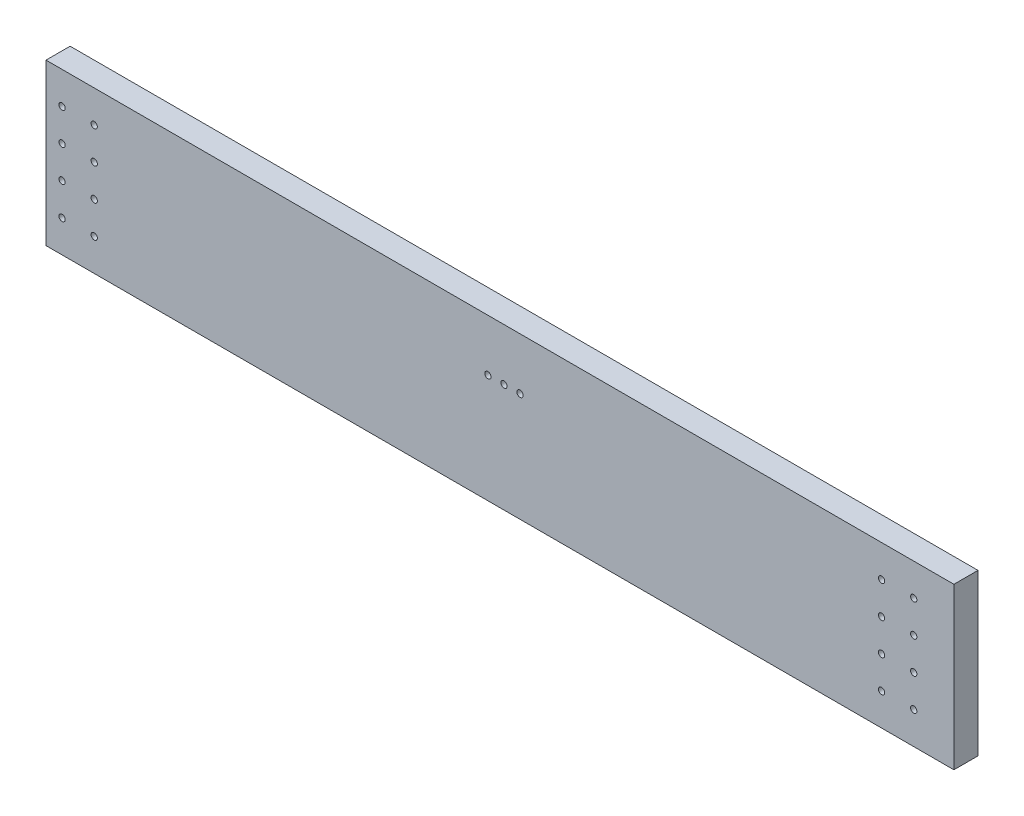
ISO-10303-21;
HEADER;
FILE_DESCRIPTION(('STEP AP214'),'2;1');
FILE_NAME('part.step','',(''),(''),'','','');
FILE_SCHEMA(('AUTOMOTIVE_DESIGN { 1 0 10303 214 1 1 1 1 }'));
ENDSEC;
DATA;
#1=APPLICATION_CONTEXT('core data for automotive mechanical design processes');
#2=APPLICATION_PROTOCOL_DEFINITION('international standard','automotive_design',2000,#1);
#3=PRODUCT_CONTEXT('',#1,'mechanical');
#4=PRODUCT('Part','Part','',(#3));
#5=PRODUCT_RELATED_PRODUCT_CATEGORY('part','',(#4));
#6=PRODUCT_DEFINITION_FORMATION('','',#4);
#7=PRODUCT_DEFINITION_CONTEXT('part definition',#1,'design');
#8=PRODUCT_DEFINITION('design','',#6,#7);
#9=PRODUCT_DEFINITION_SHAPE('','',#8);
#10=(LENGTH_UNIT() NAMED_UNIT(*) SI_UNIT(.MILLI.,.METRE.));
#11=(NAMED_UNIT(*) PLANE_ANGLE_UNIT() SI_UNIT($,.RADIAN.));
#12=(NAMED_UNIT(*) SI_UNIT($,.STERADIAN.) SOLID_ANGLE_UNIT());
#13=UNCERTAINTY_MEASURE_WITH_UNIT(LENGTH_MEASURE(1.E-05),#10,'distance_accuracy_value','');
#14=(GEOMETRIC_REPRESENTATION_CONTEXT(3) GLOBAL_UNCERTAINTY_ASSIGNED_CONTEXT((#13)) GLOBAL_UNIT_ASSIGNED_CONTEXT((#10,
#11,#12)) REPRESENTATION_CONTEXT('',''));
#15=CARTESIAN_POINT('',(0.,0.,0.));
#16=DIRECTION('',(0.,0.,1.));
#17=DIRECTION('',(1.,0.,0.));
#18=AXIS2_PLACEMENT_3D('',#15,#16,#17);
#19=CARTESIAN_POINT('',(0.,0.,19.05));
#20=DIRECTION('',(0.,1.,0.));
#21=DIRECTION('',(0.,0.,1.));
#22=AXIS2_PLACEMENT_3D('',#19,#20,#21);
#23=PLANE('',#22);
#24=DIRECTION('',(1.,0.,0.));
#25=VECTOR('',#24,1.);
#26=CARTESIAN_POINT('',(0.,0.,0.));
#27=LINE('',#26,#25);
#28=CARTESIAN_POINT('',(0.,0.,0.));
#29=VERTEX_POINT('',#28);
#30=CARTESIAN_POINT('',(717.55,0.,0.));
#31=VERTEX_POINT('',#30);
#32=EDGE_CURVE('E119',#29,#31,#27,.T.);
#33=ORIENTED_EDGE('',*,*,#32,.T.);
#34=DIRECTION('',(0.,0.,-1.));
#35=VECTOR('',#34,1.);
#36=CARTESIAN_POINT('',(717.55,0.,19.05));
#37=LINE('',#36,#35);
#38=CARTESIAN_POINT('',(717.55,0.,19.05));
#39=VERTEX_POINT('',#38);
#40=EDGE_CURVE('E11',#39,#31,#37,.T.);
#41=ORIENTED_EDGE('',*,*,#40,.F.);
#42=DIRECTION('',(1.,0.,0.));
#43=VECTOR('',#42,1.);
#44=CARTESIAN_POINT('',(0.,0.,19.05));
#45=LINE('',#44,#43);
#46=CARTESIAN_POINT('',(0.,0.,19.05));
#47=VERTEX_POINT('',#46);
#48=EDGE_CURVE('E99',#47,#39,#45,.T.);
#49=ORIENTED_EDGE('',*,*,#48,.F.);
#50=DIRECTION('',(0.,0.,-1.));
#51=VECTOR('',#50,1.);
#52=CARTESIAN_POINT('',(0.,0.,19.05));
#53=LINE('',#52,#51);
#54=EDGE_CURVE('E66',#47,#29,#53,.T.);
#55=ORIENTED_EDGE('',*,*,#54,.T.);
#56=EDGE_LOOP('',(#33,#41,#49,#55));
#57=FACE_BOUND('',#56,.T.);
#58=ADVANCED_FACE('F47',(#57),#23,.F.);
#59=CARTESIAN_POINT('',(717.55,0.,19.05));
#60=DIRECTION('',(-1.,0.,0.));
#61=DIRECTION('',(0.,0.,1.));
#62=AXIS2_PLACEMENT_3D('',#59,#60,#61);
#63=PLANE('',#62);
#64=DIRECTION('',(0.,1.,0.));
#65=VECTOR('',#64,1.);
#66=CARTESIAN_POINT('',(717.55,0.,0.));
#67=LINE('',#66,#65);
#68=CARTESIAN_POINT('',(717.55,127.,0.));
#69=VERTEX_POINT('',#68);
#70=EDGE_CURVE('E105',#31,#69,#67,.T.);
#71=ORIENTED_EDGE('',*,*,#70,.T.);
#72=DIRECTION('',(0.,0.,-1.));
#73=VECTOR('',#72,1.);
#74=CARTESIAN_POINT('',(717.55,127.,19.05));
#75=LINE('',#74,#73);
#76=CARTESIAN_POINT('',(717.55,127.,19.05));
#77=VERTEX_POINT('',#76);
#78=EDGE_CURVE('E57',#77,#69,#75,.T.);
#79=ORIENTED_EDGE('',*,*,#78,.F.);
#80=DIRECTION('',(0.,1.,0.));
#81=VECTOR('',#80,1.);
#82=CARTESIAN_POINT('',(717.55,0.,19.05));
#83=LINE('',#82,#81);
#84=EDGE_CURVE('E91',#39,#77,#83,.T.);
#85=ORIENTED_EDGE('',*,*,#84,.F.);
#86=ORIENTED_EDGE('',*,*,#40,.T.);
#87=EDGE_LOOP('',(#71,#79,#85,#86));
#88=FACE_BOUND('',#87,.T.);
#89=ADVANCED_FACE('F104',(#88),#63,.F.);
#90=CARTESIAN_POINT('',(0.,127.,19.05));
#91=DIRECTION('',(0.,1.,0.));
#92=DIRECTION('',(0.,0.,1.));
#93=AXIS2_PLACEMENT_3D('',#90,#91,#92);
#94=PLANE('',#93);
#95=DIRECTION('',(1.,0.,0.));
#96=VECTOR('',#95,1.);
#97=CARTESIAN_POINT('',(0.,127.,0.));
#98=LINE('',#97,#96);
#99=CARTESIAN_POINT('',(0.,127.,0.));
#100=VERTEX_POINT('',#99);
#101=EDGE_CURVE('E124',#100,#69,#98,.T.);
#102=ORIENTED_EDGE('',*,*,#101,.F.);
#103=DIRECTION('',(0.,0.,-1.));
#104=VECTOR('',#103,1.);
#105=CARTESIAN_POINT('',(0.,127.,19.05));
#106=LINE('',#105,#104);
#107=CARTESIAN_POINT('',(0.,127.,19.05));
#108=VERTEX_POINT('',#107);
#109=EDGE_CURVE('E80',#108,#100,#106,.T.);
#110=ORIENTED_EDGE('',*,*,#109,.F.);
#111=DIRECTION('',(1.,0.,0.));
#112=VECTOR('',#111,1.);
#113=CARTESIAN_POINT('',(0.,127.,19.05));
#114=LINE('',#113,#112);
#115=EDGE_CURVE('E98',#108,#77,#114,.T.);
#116=ORIENTED_EDGE('',*,*,#115,.T.);
#117=ORIENTED_EDGE('',*,*,#78,.T.);
#118=EDGE_LOOP('',(#102,#110,#116,#117));
#119=FACE_BOUND('',#118,.T.);
#120=ADVANCED_FACE('F110',(#119),#94,.T.);
#121=CARTESIAN_POINT('',(0.,0.,19.05));
#122=DIRECTION('',(-1.,0.,0.));
#123=DIRECTION('',(0.,0.,1.));
#124=AXIS2_PLACEMENT_3D('',#121,#122,#123);
#125=PLANE('',#124);
#126=DIRECTION('',(0.,1.,0.));
#127=VECTOR('',#126,1.);
#128=CARTESIAN_POINT('',(0.,0.,0.));
#129=LINE('',#128,#127);
#130=EDGE_CURVE('E127',#29,#100,#129,.T.);
#131=ORIENTED_EDGE('',*,*,#130,.F.);
#132=ORIENTED_EDGE('',*,*,#54,.F.);
#133=DIRECTION('',(0.,1.,0.));
#134=VECTOR('',#133,1.);
#135=CARTESIAN_POINT('',(0.,0.,19.05));
#136=LINE('',#135,#134);
#137=EDGE_CURVE('E112',#47,#108,#136,.T.);
#138=ORIENTED_EDGE('',*,*,#137,.T.);
#139=ORIENTED_EDGE('',*,*,#109,.T.);
#140=EDGE_LOOP('',(#131,#132,#138,#139));
#141=FACE_BOUND('',#140,.T.);
#142=ADVANCED_FACE('F228',(#141),#125,.T.);
#143=CARTESIAN_POINT('',(0.,0.,19.05));
#144=DIRECTION('',(0.,0.,1.));
#145=DIRECTION('',(1.,0.,0.));
#146=AXIS2_PLACEMENT_3D('',#143,#144,#145);
#147=PLANE('',#146);
#148=CARTESIAN_POINT('',(349.25,85.979,19.05));
#149=DIRECTION('',(0.,0.,1.));
#150=DIRECTION('',(1.,0.,0.));
#151=AXIS2_PLACEMENT_3D('',#148,#149,#150);
#152=CIRCLE('',#151,2.48920000000001);
#153=CARTESIAN_POINT('',(351.7392,85.979,19.05));
#154=VERTEX_POINT('',#153);
#155=EDGE_CURVE('E434',#154,#154,#152,.T.);
#156=ORIENTED_EDGE('',*,*,#155,.F.);
#157=EDGE_LOOP('',(#156));
#158=FACE_BOUND('',#157,.T.);
#159=CARTESIAN_POINT('',(361.95,85.979,19.05));
#160=DIRECTION('',(0.,0.,1.));
#161=DIRECTION('',(1.,0.,0.));
#162=AXIS2_PLACEMENT_3D('',#159,#160,#161);
#163=CIRCLE('',#162,2.48920000000001);
#164=CARTESIAN_POINT('',(364.4392,85.979,19.05));
#165=VERTEX_POINT('',#164);
#166=EDGE_CURVE('E457',#165,#165,#163,.T.);
#167=ORIENTED_EDGE('',*,*,#166,.F.);
#168=EDGE_LOOP('',(#167));
#169=FACE_BOUND('',#168,.T.);
#170=CARTESIAN_POINT('',(374.65,85.979,19.05));
#171=DIRECTION('',(0.,0.,1.));
#172=DIRECTION('',(1.,0.,0.));
#173=AXIS2_PLACEMENT_3D('',#170,#171,#172);
#174=CIRCLE('',#173,2.48920000000001);
#175=CARTESIAN_POINT('',(377.1392,85.979,19.05));
#176=VERTEX_POINT('',#175);
#177=EDGE_CURVE('E449',#176,#176,#174,.T.);
#178=ORIENTED_EDGE('',*,*,#177,.F.);
#179=EDGE_LOOP('',(#178));
#180=FACE_BOUND('',#179,.T.);
#181=CARTESIAN_POINT('',(38.1,25.4,19.05));
#182=DIRECTION('',(0.,0.,1.));
#183=DIRECTION('',(1.,0.,0.));
#184=AXIS2_PLACEMENT_3D('',#181,#182,#183);
#185=CIRCLE('',#184,2.4892);
#186=CARTESIAN_POINT('',(40.5892,25.4,19.05));
#187=VERTEX_POINT('',#186);
#188=EDGE_CURVE('E343',#187,#187,#185,.T.);
#189=ORIENTED_EDGE('',*,*,#188,.F.);
#190=EDGE_LOOP('',(#189));
#191=FACE_BOUND('',#190,.T.);
#192=CARTESIAN_POINT('',(12.7,76.2,19.05));
#193=DIRECTION('',(0.,0.,1.));
#194=DIRECTION('',(1.,0.,0.));
#195=AXIS2_PLACEMENT_3D('',#192,#193,#194);
#196=CIRCLE('',#195,2.4892);
#197=CARTESIAN_POINT('',(15.1892,76.2,19.05));
#198=VERTEX_POINT('',#197);
#199=EDGE_CURVE('E336',#198,#198,#196,.T.);
#200=ORIENTED_EDGE('',*,*,#199,.F.);
#201=EDGE_LOOP('',(#200));
#202=FACE_BOUND('',#201,.T.);
#203=CARTESIAN_POINT('',(12.7,50.8,19.05));
#204=DIRECTION('',(0.,0.,1.));
#205=DIRECTION('',(1.,0.,0.));
#206=AXIS2_PLACEMENT_3D('',#203,#204,#205);
#207=CIRCLE('',#206,2.48919999999999);
#208=CARTESIAN_POINT('',(15.1892,50.8,19.05));
#209=VERTEX_POINT('',#208);
#210=EDGE_CURVE('E329',#209,#209,#207,.T.);
#211=ORIENTED_EDGE('',*,*,#210,.F.);
#212=EDGE_LOOP('',(#211));
#213=FACE_BOUND('',#212,.T.);
#214=CARTESIAN_POINT('',(12.7,25.4,19.05));
#215=DIRECTION('',(0.,0.,1.));
#216=DIRECTION('',(1.,0.,0.));
#217=AXIS2_PLACEMENT_3D('',#214,#215,#216);
#218=CIRCLE('',#217,2.4892);
#219=CARTESIAN_POINT('',(15.1892,25.4,19.05));
#220=VERTEX_POINT('',#219);
#221=EDGE_CURVE('E315',#220,#220,#218,.T.);
#222=ORIENTED_EDGE('',*,*,#221,.F.);
#223=EDGE_LOOP('',(#222));
#224=FACE_BOUND('',#223,.T.);
#225=CARTESIAN_POINT('',(38.1,50.8,19.05));
#226=DIRECTION('',(0.,0.,1.));
#227=DIRECTION('',(1.,0.,0.));
#228=AXIS2_PLACEMENT_3D('',#225,#226,#227);
#229=CIRCLE('',#228,2.4892);
#230=CARTESIAN_POINT('',(40.5892,50.8,19.05));
#231=VERTEX_POINT('',#230);
#232=EDGE_CURVE('E346',#231,#231,#229,.T.);
#233=ORIENTED_EDGE('',*,*,#232,.F.);
#234=EDGE_LOOP('',(#233));
#235=FACE_BOUND('',#234,.T.);
#236=CARTESIAN_POINT('',(38.1,76.2,19.05));
#237=DIRECTION('',(0.,0.,1.));
#238=DIRECTION('',(1.,0.,0.));
#239=AXIS2_PLACEMENT_3D('',#236,#237,#238);
#240=CIRCLE('',#239,2.4892);
#241=CARTESIAN_POINT('',(40.5892,76.2,19.05));
#242=VERTEX_POINT('',#241);
#243=EDGE_CURVE('E356',#242,#242,#240,.T.);
#244=ORIENTED_EDGE('',*,*,#243,.F.);
#245=EDGE_LOOP('',(#244));
#246=FACE_BOUND('',#245,.T.);
#247=CARTESIAN_POINT('',(38.1,101.6,19.05));
#248=DIRECTION('',(0.,0.,1.));
#249=DIRECTION('',(1.,0.,0.));
#250=AXIS2_PLACEMENT_3D('',#247,#248,#249);
#251=CIRCLE('',#250,2.4892);
#252=CARTESIAN_POINT('',(40.5892,101.6,19.05));
#253=VERTEX_POINT('',#252);
#254=EDGE_CURVE('E352',#253,#253,#251,.T.);
#255=ORIENTED_EDGE('',*,*,#254,.F.);
#256=EDGE_LOOP('',(#255));
#257=FACE_BOUND('',#256,.T.);
#258=CARTESIAN_POINT('',(685.8,101.6,19.05));
#259=DIRECTION('',(0.,0.,1.));
#260=DIRECTION('',(1.,0.,0.));
#261=AXIS2_PLACEMENT_3D('',#258,#259,#260);
#262=CIRCLE('',#261,2.48919999999995);
#263=CARTESIAN_POINT('',(688.2892,101.6,19.05));
#264=VERTEX_POINT('',#263);
#265=EDGE_CURVE('E272',#264,#264,#262,.T.);
#266=ORIENTED_EDGE('',*,*,#265,.F.);
#267=EDGE_LOOP('',(#266));
#268=FACE_BOUND('',#267,.T.);
#269=CARTESIAN_POINT('',(660.4,101.6,19.05));
#270=DIRECTION('',(0.,0.,1.));
#271=DIRECTION('',(1.,0.,0.));
#272=AXIS2_PLACEMENT_3D('',#269,#270,#271);
#273=CIRCLE('',#272,2.48919999999995);
#274=CARTESIAN_POINT('',(662.8892,101.6,19.05));
#275=VERTEX_POINT('',#274);
#276=EDGE_CURVE('E330',#275,#275,#273,.T.);
#277=ORIENTED_EDGE('',*,*,#276,.F.);
#278=EDGE_LOOP('',(#277));
#279=FACE_BOUND('',#278,.T.);
#280=CARTESIAN_POINT('',(660.4,76.2,19.05));
#281=DIRECTION('',(0.,0.,1.));
#282=DIRECTION('',(1.,0.,0.));
#283=AXIS2_PLACEMENT_3D('',#280,#281,#282);
#284=CIRCLE('',#283,2.48919999999995);
#285=CARTESIAN_POINT('',(662.8892,76.2,19.05));
#286=VERTEX_POINT('',#285);
#287=EDGE_CURVE('E339',#286,#286,#284,.T.);
#288=ORIENTED_EDGE('',*,*,#287,.F.);
#289=EDGE_LOOP('',(#288));
#290=FACE_BOUND('',#289,.T.);
#291=CARTESIAN_POINT('',(660.4,50.8,19.05));
#292=DIRECTION('',(0.,0.,1.));
#293=DIRECTION('',(1.,0.,0.));
#294=AXIS2_PLACEMENT_3D('',#291,#292,#293);
#295=CIRCLE('',#294,2.48919999999995);
#296=CARTESIAN_POINT('',(662.8892,50.8,19.05));
#297=VERTEX_POINT('',#296);
#298=EDGE_CURVE('E412',#297,#297,#295,.T.);
#299=ORIENTED_EDGE('',*,*,#298,.F.);
#300=EDGE_LOOP('',(#299));
#301=FACE_BOUND('',#300,.T.);
#302=CARTESIAN_POINT('',(660.4,25.4,19.05));
#303=DIRECTION('',(0.,0.,1.));
#304=DIRECTION('',(1.,0.,0.));
#305=AXIS2_PLACEMENT_3D('',#302,#303,#304);
#306=CIRCLE('',#305,2.48919999999995);
#307=CARTESIAN_POINT('',(662.8892,25.4,19.05));
#308=VERTEX_POINT('',#307);
#309=EDGE_CURVE('E416',#308,#308,#306,.T.);
#310=ORIENTED_EDGE('',*,*,#309,.F.);
#311=EDGE_LOOP('',(#310));
#312=FACE_BOUND('',#311,.T.);
#313=CARTESIAN_POINT('',(685.8,76.2,19.05));
#314=DIRECTION('',(0.,0.,1.));
#315=DIRECTION('',(1.,0.,0.));
#316=AXIS2_PLACEMENT_3D('',#313,#314,#315);
#317=CIRCLE('',#316,2.48919999999995);
#318=CARTESIAN_POINT('',(688.2892,76.2,19.05));
#319=VERTEX_POINT('',#318);
#320=EDGE_CURVE('E420',#319,#319,#317,.T.);
#321=ORIENTED_EDGE('',*,*,#320,.F.);
#322=EDGE_LOOP('',(#321));
#323=FACE_BOUND('',#322,.T.);
#324=CARTESIAN_POINT('',(685.8,50.8,19.05));
#325=DIRECTION('',(0.,0.,1.));
#326=DIRECTION('',(1.,0.,0.));
#327=AXIS2_PLACEMENT_3D('',#324,#325,#326);
#328=CIRCLE('',#327,2.48919999999995);
#329=CARTESIAN_POINT('',(688.2892,50.8,19.05));
#330=VERTEX_POINT('',#329);
#331=EDGE_CURVE('E424',#330,#330,#328,.T.);
#332=ORIENTED_EDGE('',*,*,#331,.F.);
#333=EDGE_LOOP('',(#332));
#334=FACE_BOUND('',#333,.T.);
#335=CARTESIAN_POINT('',(685.8,25.4,19.05));
#336=DIRECTION('',(0.,0.,1.));
#337=DIRECTION('',(1.,0.,0.));
#338=AXIS2_PLACEMENT_3D('',#335,#336,#337);
#339=CIRCLE('',#338,2.48919999999995);
#340=CARTESIAN_POINT('',(688.2892,25.4,19.05));
#341=VERTEX_POINT('',#340);
#342=EDGE_CURVE('E426',#341,#341,#339,.T.);
#343=ORIENTED_EDGE('',*,*,#342,.F.);
#344=EDGE_LOOP('',(#343));
#345=FACE_BOUND('',#344,.T.);
#346=CARTESIAN_POINT('',(12.7,101.6,19.05));
#347=DIRECTION('',(0.,0.,1.));
#348=DIRECTION('',(1.,0.,0.));
#349=AXIS2_PLACEMENT_3D('',#346,#347,#348);
#350=CIRCLE('',#349,2.48919999999999);
#351=CARTESIAN_POINT('',(15.1892,101.6,19.05));
#352=VERTEX_POINT('',#351);
#353=EDGE_CURVE('E140',#352,#352,#350,.T.);
#354=ORIENTED_EDGE('',*,*,#353,.F.);
#355=EDGE_LOOP('',(#354));
#356=FACE_BOUND('',#355,.T.);
#357=ORIENTED_EDGE('',*,*,#48,.T.);
#358=ORIENTED_EDGE('',*,*,#84,.T.);
#359=ORIENTED_EDGE('',*,*,#115,.F.);
#360=ORIENTED_EDGE('',*,*,#137,.F.);
#361=EDGE_LOOP('',(#357,#358,#359,#360));
#362=FACE_BOUND('',#361,.T.);
#363=ADVANCED_FACE('F95',(#158,#169,#180,#191,#202,#213,#224,#235,#246,#257,#268,#279,#290,#301,
#312,#323,#334,#345,#356,#362),#147,.T.);
#364=CARTESIAN_POINT('',(0.,0.,0.));
#365=DIRECTION('',(0.,0.,1.));
#366=DIRECTION('',(1.,0.,0.));
#367=AXIS2_PLACEMENT_3D('',#364,#365,#366);
#368=PLANE('',#367);
#369=CARTESIAN_POINT('',(349.25,85.979,0.));
#370=DIRECTION('',(0.,0.,1.));
#371=DIRECTION('',(1.,0.,0.));
#372=AXIS2_PLACEMENT_3D('',#369,#370,#371);
#373=CIRCLE('',#372,2.48920000000001);
#374=CARTESIAN_POINT('',(351.7392,85.979,0.));
#375=VERTEX_POINT('',#374);
#376=EDGE_CURVE('E428',#375,#375,#373,.T.);
#377=ORIENTED_EDGE('',*,*,#376,.T.);
#378=EDGE_LOOP('',(#377));
#379=FACE_BOUND('',#378,.T.);
#380=CARTESIAN_POINT('',(361.95,85.979,0.));
#381=DIRECTION('',(0.,0.,1.));
#382=DIRECTION('',(1.,0.,0.));
#383=AXIS2_PLACEMENT_3D('',#380,#381,#382);
#384=CIRCLE('',#383,2.48920000000001);
#385=CARTESIAN_POINT('',(364.4392,85.979,0.));
#386=VERTEX_POINT('',#385);
#387=EDGE_CURVE('E453',#386,#386,#384,.T.);
#388=ORIENTED_EDGE('',*,*,#387,.T.);
#389=EDGE_LOOP('',(#388));
#390=FACE_BOUND('',#389,.T.);
#391=CARTESIAN_POINT('',(374.65,85.979,0.));
#392=DIRECTION('',(0.,0.,1.));
#393=DIRECTION('',(1.,0.,0.));
#394=AXIS2_PLACEMENT_3D('',#391,#392,#393);
#395=CIRCLE('',#394,2.48920000000001);
#396=CARTESIAN_POINT('',(377.1392,85.979,0.));
#397=VERTEX_POINT('',#396);
#398=EDGE_CURVE('E445',#397,#397,#395,.T.);
#399=ORIENTED_EDGE('',*,*,#398,.T.);
#400=EDGE_LOOP('',(#399));
#401=FACE_BOUND('',#400,.T.);
#402=CARTESIAN_POINT('',(38.1,25.4,0.));
#403=DIRECTION('',(0.,0.,1.));
#404=DIRECTION('',(1.,0.,0.));
#405=AXIS2_PLACEMENT_3D('',#402,#403,#404);
#406=CIRCLE('',#405,2.4892);
#407=CARTESIAN_POINT('',(40.5892,25.4,0.));
#408=VERTEX_POINT('',#407);
#409=EDGE_CURVE('E50',#408,#408,#406,.T.);
#410=ORIENTED_EDGE('',*,*,#409,.T.);
#411=EDGE_LOOP('',(#410));
#412=FACE_BOUND('',#411,.T.);
#413=CARTESIAN_POINT('',(12.7,76.2,0.));
#414=DIRECTION('',(0.,0.,1.));
#415=DIRECTION('',(1.,0.,0.));
#416=AXIS2_PLACEMENT_3D('',#413,#414,#415);
#417=CIRCLE('',#416,2.4892);
#418=CARTESIAN_POINT('',(15.1892,76.2,0.));
#419=VERTEX_POINT('',#418);
#420=EDGE_CURVE('E191',#419,#419,#417,.T.);
#421=ORIENTED_EDGE('',*,*,#420,.T.);
#422=EDGE_LOOP('',(#421));
#423=FACE_BOUND('',#422,.T.);
#424=CARTESIAN_POINT('',(12.7,50.8,0.));
#425=DIRECTION('',(0.,0.,1.));
#426=DIRECTION('',(1.,0.,0.));
#427=AXIS2_PLACEMENT_3D('',#424,#425,#426);
#428=CIRCLE('',#427,2.48919999999999);
#429=CARTESIAN_POINT('',(15.1892,50.8,0.));
#430=VERTEX_POINT('',#429);
#431=EDGE_CURVE('E188',#430,#430,#428,.T.);
#432=ORIENTED_EDGE('',*,*,#431,.T.);
#433=EDGE_LOOP('',(#432));
#434=FACE_BOUND('',#433,.T.);
#435=CARTESIAN_POINT('',(12.7,25.4,0.));
#436=DIRECTION('',(0.,0.,1.));
#437=DIRECTION('',(1.,0.,0.));
#438=AXIS2_PLACEMENT_3D('',#435,#436,#437);
#439=CIRCLE('',#438,2.4892);
#440=CARTESIAN_POINT('',(15.1892,25.4,0.));
#441=VERTEX_POINT('',#440);
#442=EDGE_CURVE('E184',#441,#441,#439,.T.);
#443=ORIENTED_EDGE('',*,*,#442,.T.);
#444=EDGE_LOOP('',(#443));
#445=FACE_BOUND('',#444,.T.);
#446=CARTESIAN_POINT('',(38.1,50.8,0.));
#447=DIRECTION('',(0.,0.,1.));
#448=DIRECTION('',(1.,0.,0.));
#449=AXIS2_PLACEMENT_3D('',#446,#447,#448);
#450=CIRCLE('',#449,2.4892);
#451=CARTESIAN_POINT('',(40.5892,50.8,0.));
#452=VERTEX_POINT('',#451);
#453=EDGE_CURVE('E180',#452,#452,#450,.T.);
#454=ORIENTED_EDGE('',*,*,#453,.T.);
#455=EDGE_LOOP('',(#454));
#456=FACE_BOUND('',#455,.T.);
#457=CARTESIAN_POINT('',(38.1,76.2,0.));
#458=DIRECTION('',(0.,0.,1.));
#459=DIRECTION('',(1.,0.,0.));
#460=AXIS2_PLACEMENT_3D('',#457,#458,#459);
#461=CIRCLE('',#460,2.4892);
#462=CARTESIAN_POINT('',(40.5892,76.2,0.));
#463=VERTEX_POINT('',#462);
#464=EDGE_CURVE('E176',#463,#463,#461,.T.);
#465=ORIENTED_EDGE('',*,*,#464,.T.);
#466=EDGE_LOOP('',(#465));
#467=FACE_BOUND('',#466,.T.);
#468=CARTESIAN_POINT('',(38.1,101.6,0.));
#469=DIRECTION('',(0.,0.,1.));
#470=DIRECTION('',(1.,0.,0.));
#471=AXIS2_PLACEMENT_3D('',#468,#469,#470);
#472=CIRCLE('',#471,2.4892);
#473=CARTESIAN_POINT('',(40.5892,101.6,0.));
#474=VERTEX_POINT('',#473);
#475=EDGE_CURVE('E172',#474,#474,#472,.T.);
#476=ORIENTED_EDGE('',*,*,#475,.T.);
#477=EDGE_LOOP('',(#476));
#478=FACE_BOUND('',#477,.T.);
#479=CARTESIAN_POINT('',(685.8,101.6,0.));
#480=DIRECTION('',(0.,0.,1.));
#481=DIRECTION('',(1.,0.,0.));
#482=AXIS2_PLACEMENT_3D('',#479,#480,#481);
#483=CIRCLE('',#482,2.48919999999995);
#484=CARTESIAN_POINT('',(688.2892,101.6,0.));
#485=VERTEX_POINT('',#484);
#486=EDGE_CURVE('E168',#485,#485,#483,.T.);
#487=ORIENTED_EDGE('',*,*,#486,.T.);
#488=EDGE_LOOP('',(#487));
#489=FACE_BOUND('',#488,.T.);
#490=CARTESIAN_POINT('',(660.4,101.6,0.));
#491=DIRECTION('',(0.,0.,1.));
#492=DIRECTION('',(1.,0.,0.));
#493=AXIS2_PLACEMENT_3D('',#490,#491,#492);
#494=CIRCLE('',#493,2.48919999999995);
#495=CARTESIAN_POINT('',(662.8892,101.6,0.));
#496=VERTEX_POINT('',#495);
#497=EDGE_CURVE('E164',#496,#496,#494,.T.);
#498=ORIENTED_EDGE('',*,*,#497,.T.);
#499=EDGE_LOOP('',(#498));
#500=FACE_BOUND('',#499,.T.);
#501=CARTESIAN_POINT('',(660.4,76.2,0.));
#502=DIRECTION('',(0.,0.,1.));
#503=DIRECTION('',(1.,0.,0.));
#504=AXIS2_PLACEMENT_3D('',#501,#502,#503);
#505=CIRCLE('',#504,2.48919999999995);
#506=CARTESIAN_POINT('',(662.8892,76.2,0.));
#507=VERTEX_POINT('',#506);
#508=EDGE_CURVE('E160',#507,#507,#505,.T.);
#509=ORIENTED_EDGE('',*,*,#508,.T.);
#510=EDGE_LOOP('',(#509));
#511=FACE_BOUND('',#510,.T.);
#512=CARTESIAN_POINT('',(660.4,50.8,0.));
#513=DIRECTION('',(0.,0.,1.));
#514=DIRECTION('',(1.,0.,0.));
#515=AXIS2_PLACEMENT_3D('',#512,#513,#514);
#516=CIRCLE('',#515,2.48919999999995);
#517=CARTESIAN_POINT('',(662.8892,50.8,0.));
#518=VERTEX_POINT('',#517);
#519=EDGE_CURVE('E156',#518,#518,#516,.T.);
#520=ORIENTED_EDGE('',*,*,#519,.T.);
#521=EDGE_LOOP('',(#520));
#522=FACE_BOUND('',#521,.T.);
#523=CARTESIAN_POINT('',(660.4,25.4,0.));
#524=DIRECTION('',(0.,0.,1.));
#525=DIRECTION('',(1.,0.,0.));
#526=AXIS2_PLACEMENT_3D('',#523,#524,#525);
#527=CIRCLE('',#526,2.48919999999995);
#528=CARTESIAN_POINT('',(662.8892,25.4,0.));
#529=VERTEX_POINT('',#528);
#530=EDGE_CURVE('E152',#529,#529,#527,.T.);
#531=ORIENTED_EDGE('',*,*,#530,.T.);
#532=EDGE_LOOP('',(#531));
#533=FACE_BOUND('',#532,.T.);
#534=CARTESIAN_POINT('',(685.8,76.2,0.));
#535=DIRECTION('',(0.,0.,1.));
#536=DIRECTION('',(1.,0.,0.));
#537=AXIS2_PLACEMENT_3D('',#534,#535,#536);
#538=CIRCLE('',#537,2.48919999999995);
#539=CARTESIAN_POINT('',(688.2892,76.2,0.));
#540=VERTEX_POINT('',#539);
#541=EDGE_CURVE('E148',#540,#540,#538,.T.);
#542=ORIENTED_EDGE('',*,*,#541,.T.);
#543=EDGE_LOOP('',(#542));
#544=FACE_BOUND('',#543,.T.);
#545=CARTESIAN_POINT('',(685.8,50.8,0.));
#546=DIRECTION('',(0.,0.,1.));
#547=DIRECTION('',(1.,0.,0.));
#548=AXIS2_PLACEMENT_3D('',#545,#546,#547);
#549=CIRCLE('',#548,2.48919999999995);
#550=CARTESIAN_POINT('',(688.2892,50.8,0.));
#551=VERTEX_POINT('',#550);
#552=EDGE_CURVE('E144',#551,#551,#549,.T.);
#553=ORIENTED_EDGE('',*,*,#552,.T.);
#554=EDGE_LOOP('',(#553));
#555=FACE_BOUND('',#554,.T.);
#556=CARTESIAN_POINT('',(685.8,25.4,0.));
#557=DIRECTION('',(0.,0.,1.));
#558=DIRECTION('',(1.,0.,0.));
#559=AXIS2_PLACEMENT_3D('',#556,#557,#558);
#560=CIRCLE('',#559,2.48919999999995);
#561=CARTESIAN_POINT('',(688.2892,25.4,0.));
#562=VERTEX_POINT('',#561);
#563=EDGE_CURVE('E139',#562,#562,#560,.T.);
#564=ORIENTED_EDGE('',*,*,#563,.T.);
#565=EDGE_LOOP('',(#564));
#566=FACE_BOUND('',#565,.T.);
#567=CARTESIAN_POINT('',(12.7,101.6,0.));
#568=DIRECTION('',(0.,0.,1.));
#569=DIRECTION('',(1.,0.,0.));
#570=AXIS2_PLACEMENT_3D('',#567,#568,#569);
#571=CIRCLE('',#570,2.48919999999999);
#572=CARTESIAN_POINT('',(15.1892,101.6,0.));
#573=VERTEX_POINT('',#572);
#574=EDGE_CURVE('E135',#573,#573,#571,.T.);
#575=ORIENTED_EDGE('',*,*,#574,.T.);
#576=EDGE_LOOP('',(#575));
#577=FACE_BOUND('',#576,.T.);
#578=ORIENTED_EDGE('',*,*,#32,.F.);
#579=ORIENTED_EDGE('',*,*,#130,.T.);
#580=ORIENTED_EDGE('',*,*,#101,.T.);
#581=ORIENTED_EDGE('',*,*,#70,.F.);
#582=EDGE_LOOP('',(#578,#579,#580,#581));
#583=FACE_BOUND('',#582,.T.);
#584=ADVANCED_FACE('F202',(#379,#390,#401,#412,#423,#434,#445,#456,#467,#478,#489,#500,#511,
#522,#533,#544,#555,#566,#577,#583),#368,.F.);
#585=CARTESIAN_POINT('',(12.7,101.6,-6.35));
#586=DIRECTION('',(0.,0.,1.));
#587=DIRECTION('',(1.,0.,0.));
#588=AXIS2_PLACEMENT_3D('',#585,#586,#587);
#589=CYLINDRICAL_SURFACE('',#588,2.48919999999999);
#590=ORIENTED_EDGE('',*,*,#353,.T.);
#591=EDGE_LOOP('',(#590));
#592=FACE_BOUND('',#591,.T.);
#593=ORIENTED_EDGE('',*,*,#574,.F.);
#594=EDGE_LOOP('',(#593));
#595=FACE_BOUND('',#594,.T.);
#596=ADVANCED_FACE('F240',(#592,#595),#589,.F.);
#597=CARTESIAN_POINT('',(685.8,25.4,-6.35));
#598=DIRECTION('',(0.,0.,1.));
#599=DIRECTION('',(1.,0.,0.));
#600=AXIS2_PLACEMENT_3D('',#597,#598,#599);
#601=CYLINDRICAL_SURFACE('',#600,2.48919999999995);
#602=ORIENTED_EDGE('',*,*,#342,.T.);
#603=EDGE_LOOP('',(#602));
#604=FACE_BOUND('',#603,.T.);
#605=ORIENTED_EDGE('',*,*,#563,.F.);
#606=EDGE_LOOP('',(#605));
#607=FACE_BOUND('',#606,.T.);
#608=ADVANCED_FACE('F244',(#604,#607),#601,.F.);
#609=CARTESIAN_POINT('',(685.8,50.8,-6.35));
#610=DIRECTION('',(0.,0.,1.));
#611=DIRECTION('',(1.,0.,0.));
#612=AXIS2_PLACEMENT_3D('',#609,#610,#611);
#613=CYLINDRICAL_SURFACE('',#612,2.48919999999995);
#614=ORIENTED_EDGE('',*,*,#331,.T.);
#615=EDGE_LOOP('',(#614));
#616=FACE_BOUND('',#615,.T.);
#617=ORIENTED_EDGE('',*,*,#552,.F.);
#618=EDGE_LOOP('',(#617));
#619=FACE_BOUND('',#618,.T.);
#620=ADVANCED_FACE('F294',(#616,#619),#613,.F.);
#621=CARTESIAN_POINT('',(685.8,76.2,-6.35));
#622=DIRECTION('',(0.,0.,1.));
#623=DIRECTION('',(1.,0.,0.));
#624=AXIS2_PLACEMENT_3D('',#621,#622,#623);
#625=CYLINDRICAL_SURFACE('',#624,2.48919999999995);
#626=ORIENTED_EDGE('',*,*,#320,.T.);
#627=EDGE_LOOP('',(#626));
#628=FACE_BOUND('',#627,.T.);
#629=ORIENTED_EDGE('',*,*,#541,.F.);
#630=EDGE_LOOP('',(#629));
#631=FACE_BOUND('',#630,.T.);
#632=ADVANCED_FACE('F300',(#628,#631),#625,.F.);
#633=CARTESIAN_POINT('',(660.4,25.4,-6.35));
#634=DIRECTION('',(0.,0.,1.));
#635=DIRECTION('',(1.,0.,0.));
#636=AXIS2_PLACEMENT_3D('',#633,#634,#635);
#637=CYLINDRICAL_SURFACE('',#636,2.48919999999995);
#638=ORIENTED_EDGE('',*,*,#309,.T.);
#639=EDGE_LOOP('',(#638));
#640=FACE_BOUND('',#639,.T.);
#641=ORIENTED_EDGE('',*,*,#530,.F.);
#642=EDGE_LOOP('',(#641));
#643=FACE_BOUND('',#642,.T.);
#644=ADVANCED_FACE('F499',(#640,#643),#637,.F.);
#645=CARTESIAN_POINT('',(660.4,50.8,-6.35));
#646=DIRECTION('',(0.,0.,1.));
#647=DIRECTION('',(1.,0.,0.));
#648=AXIS2_PLACEMENT_3D('',#645,#646,#647);
#649=CYLINDRICAL_SURFACE('',#648,2.48919999999995);
#650=ORIENTED_EDGE('',*,*,#298,.T.);
#651=EDGE_LOOP('',(#650));
#652=FACE_BOUND('',#651,.T.);
#653=ORIENTED_EDGE('',*,*,#519,.F.);
#654=EDGE_LOOP('',(#653));
#655=FACE_BOUND('',#654,.T.);
#656=ADVANCED_FACE('F495',(#652,#655),#649,.F.);
#657=CARTESIAN_POINT('',(660.4,76.2,-6.35));
#658=DIRECTION('',(0.,0.,1.));
#659=DIRECTION('',(1.,0.,0.));
#660=AXIS2_PLACEMENT_3D('',#657,#658,#659);
#661=CYLINDRICAL_SURFACE('',#660,2.48919999999995);
#662=ORIENTED_EDGE('',*,*,#287,.T.);
#663=EDGE_LOOP('',(#662));
#664=FACE_BOUND('',#663,.T.);
#665=ORIENTED_EDGE('',*,*,#508,.F.);
#666=EDGE_LOOP('',(#665));
#667=FACE_BOUND('',#666,.T.);
#668=ADVANCED_FACE('F266',(#664,#667),#661,.F.);
#669=CARTESIAN_POINT('',(660.4,101.6,-6.35));
#670=DIRECTION('',(0.,0.,1.));
#671=DIRECTION('',(1.,0.,0.));
#672=AXIS2_PLACEMENT_3D('',#669,#670,#671);
#673=CYLINDRICAL_SURFACE('',#672,2.48919999999995);
#674=ORIENTED_EDGE('',*,*,#276,.T.);
#675=EDGE_LOOP('',(#674));
#676=FACE_BOUND('',#675,.T.);
#677=ORIENTED_EDGE('',*,*,#497,.F.);
#678=EDGE_LOOP('',(#677));
#679=FACE_BOUND('',#678,.T.);
#680=ADVANCED_FACE('F261',(#676,#679),#673,.F.);
#681=CARTESIAN_POINT('',(685.8,101.6,-6.35));
#682=DIRECTION('',(0.,0.,1.));
#683=DIRECTION('',(1.,0.,0.));
#684=AXIS2_PLACEMENT_3D('',#681,#682,#683);
#685=CYLINDRICAL_SURFACE('',#684,2.48919999999995);
#686=ORIENTED_EDGE('',*,*,#265,.T.);
#687=EDGE_LOOP('',(#686));
#688=FACE_BOUND('',#687,.T.);
#689=ORIENTED_EDGE('',*,*,#486,.F.);
#690=EDGE_LOOP('',(#689));
#691=FACE_BOUND('',#690,.T.);
#692=ADVANCED_FACE('F258',(#688,#691),#685,.F.);
#693=CARTESIAN_POINT('',(38.1,101.6,-6.35));
#694=DIRECTION('',(0.,0.,1.));
#695=DIRECTION('',(1.,0.,0.));
#696=AXIS2_PLACEMENT_3D('',#693,#694,#695);
#697=CYLINDRICAL_SURFACE('',#696,2.4892);
#698=ORIENTED_EDGE('',*,*,#254,.T.);
#699=EDGE_LOOP('',(#698));
#700=FACE_BOUND('',#699,.T.);
#701=ORIENTED_EDGE('',*,*,#475,.F.);
#702=EDGE_LOOP('',(#701));
#703=FACE_BOUND('',#702,.T.);
#704=ADVANCED_FACE('F254',(#700,#703),#697,.F.);
#705=CARTESIAN_POINT('',(38.1,76.2,-6.35));
#706=DIRECTION('',(0.,0.,1.));
#707=DIRECTION('',(1.,0.,0.));
#708=AXIS2_PLACEMENT_3D('',#705,#706,#707);
#709=CYLINDRICAL_SURFACE('',#708,2.4892);
#710=ORIENTED_EDGE('',*,*,#243,.T.);
#711=EDGE_LOOP('',(#710));
#712=FACE_BOUND('',#711,.T.);
#713=ORIENTED_EDGE('',*,*,#464,.F.);
#714=EDGE_LOOP('',(#713));
#715=FACE_BOUND('',#714,.T.);
#716=ADVANCED_FACE('F250',(#712,#715),#709,.F.);
#717=CARTESIAN_POINT('',(38.1,50.8,-6.35));
#718=DIRECTION('',(0.,0.,1.));
#719=DIRECTION('',(1.,0.,0.));
#720=AXIS2_PLACEMENT_3D('',#717,#718,#719);
#721=CYLINDRICAL_SURFACE('',#720,2.4892);
#722=ORIENTED_EDGE('',*,*,#232,.T.);
#723=EDGE_LOOP('',(#722));
#724=FACE_BOUND('',#723,.T.);
#725=ORIENTED_EDGE('',*,*,#453,.F.);
#726=EDGE_LOOP('',(#725));
#727=FACE_BOUND('',#726,.T.);
#728=ADVANCED_FACE('F246',(#724,#727),#721,.F.);
#729=CARTESIAN_POINT('',(12.7,25.4,-6.35));
#730=DIRECTION('',(0.,0.,1.));
#731=DIRECTION('',(1.,0.,0.));
#732=AXIS2_PLACEMENT_3D('',#729,#730,#731);
#733=CYLINDRICAL_SURFACE('',#732,2.4892);
#734=ORIENTED_EDGE('',*,*,#221,.T.);
#735=EDGE_LOOP('',(#734));
#736=FACE_BOUND('',#735,.T.);
#737=ORIENTED_EDGE('',*,*,#442,.F.);
#738=EDGE_LOOP('',(#737));
#739=FACE_BOUND('',#738,.T.);
#740=ADVANCED_FACE('F249',(#736,#739),#733,.F.);
#741=CARTESIAN_POINT('',(12.7,50.8,-6.35));
#742=DIRECTION('',(0.,0.,1.));
#743=DIRECTION('',(1.,0.,0.));
#744=AXIS2_PLACEMENT_3D('',#741,#742,#743);
#745=CYLINDRICAL_SURFACE('',#744,2.48919999999999);
#746=ORIENTED_EDGE('',*,*,#210,.T.);
#747=EDGE_LOOP('',(#746));
#748=FACE_BOUND('',#747,.T.);
#749=ORIENTED_EDGE('',*,*,#431,.F.);
#750=EDGE_LOOP('',(#749));
#751=FACE_BOUND('',#750,.T.);
#752=ADVANCED_FACE('F218',(#748,#751),#745,.F.);
#753=CARTESIAN_POINT('',(12.7,76.2,-6.35));
#754=DIRECTION('',(0.,0.,1.));
#755=DIRECTION('',(1.,0.,0.));
#756=AXIS2_PLACEMENT_3D('',#753,#754,#755);
#757=CYLINDRICAL_SURFACE('',#756,2.4892);
#758=ORIENTED_EDGE('',*,*,#199,.T.);
#759=EDGE_LOOP('',(#758));
#760=FACE_BOUND('',#759,.T.);
#761=ORIENTED_EDGE('',*,*,#420,.F.);
#762=EDGE_LOOP('',(#761));
#763=FACE_BOUND('',#762,.T.);
#764=ADVANCED_FACE('F207',(#760,#763),#757,.F.);
#765=CARTESIAN_POINT('',(38.1,25.4,-6.35));
#766=DIRECTION('',(0.,0.,1.));
#767=DIRECTION('',(1.,0.,0.));
#768=AXIS2_PLACEMENT_3D('',#765,#766,#767);
#769=CYLINDRICAL_SURFACE('',#768,2.4892);
#770=ORIENTED_EDGE('',*,*,#188,.T.);
#771=EDGE_LOOP('',(#770));
#772=FACE_BOUND('',#771,.T.);
#773=ORIENTED_EDGE('',*,*,#409,.F.);
#774=EDGE_LOOP('',(#773));
#775=FACE_BOUND('',#774,.T.);
#776=ADVANCED_FACE('F204',(#772,#775),#769,.F.);
#777=CARTESIAN_POINT('',(374.65,85.979,0.));
#778=DIRECTION('',(0.,0.,1.));
#779=DIRECTION('',(1.,0.,0.));
#780=AXIS2_PLACEMENT_3D('',#777,#778,#779);
#781=CYLINDRICAL_SURFACE('',#780,2.48920000000001);
#782=CARTESIAN_POINT('',(377.1392,85.979,0.));
#783=CARTESIAN_POINT('',(377.1392,85.979,0.1984375));
#784=CARTESIAN_POINT('',(377.1392,85.979,0.396875));
#785=CARTESIAN_POINT('',(377.1392,85.979,0.79375));
#786=CARTESIAN_POINT('',(377.1392,85.979,0.9921875));
#787=CARTESIAN_POINT('',(377.1392,85.979,1.3890625));
#788=CARTESIAN_POINT('',(377.1392,85.979,1.5875));
#789=CARTESIAN_POINT('',(377.1392,85.979,1.984375));
#790=CARTESIAN_POINT('',(377.1392,85.979,2.1828125));
#791=CARTESIAN_POINT('',(377.1392,85.979,2.5796875));
#792=CARTESIAN_POINT('',(377.1392,85.979,2.778125));
#793=CARTESIAN_POINT('',(377.1392,85.979,3.175));
#794=CARTESIAN_POINT('',(377.1392,85.979,3.3734375));
#795=CARTESIAN_POINT('',(377.1392,85.979,3.7703125));
#796=CARTESIAN_POINT('',(377.1392,85.979,3.96875));
#797=CARTESIAN_POINT('',(377.1392,85.979,4.365625));
#798=CARTESIAN_POINT('',(377.1392,85.979,4.5640625));
#799=CARTESIAN_POINT('',(377.1392,85.979,4.9609375));
#800=CARTESIAN_POINT('',(377.1392,85.979,5.159375));
#801=CARTESIAN_POINT('',(377.1392,85.979,5.55625));
#802=CARTESIAN_POINT('',(377.1392,85.979,5.7546875));
#803=CARTESIAN_POINT('',(377.1392,85.979,6.1515625));
#804=CARTESIAN_POINT('',(377.1392,85.979,6.35));
#805=CARTESIAN_POINT('',(377.1392,85.979,6.746875));
#806=CARTESIAN_POINT('',(377.1392,85.979,6.9453125));
#807=CARTESIAN_POINT('',(377.1392,85.979,7.3421875));
#808=CARTESIAN_POINT('',(377.1392,85.979,7.540625));
#809=CARTESIAN_POINT('',(377.1392,85.979,7.9375));
#810=CARTESIAN_POINT('',(377.1392,85.979,8.1359375));
#811=CARTESIAN_POINT('',(377.1392,85.979,8.5328125));
#812=CARTESIAN_POINT('',(377.1392,85.979,8.73125));
#813=CARTESIAN_POINT('',(377.1392,85.979,9.128125));
#814=CARTESIAN_POINT('',(377.1392,85.979,9.3265625));
#815=CARTESIAN_POINT('',(377.1392,85.979,9.7234375));
#816=CARTESIAN_POINT('',(377.1392,85.979,9.921875));
#817=CARTESIAN_POINT('',(377.1392,85.979,10.31875));
#818=CARTESIAN_POINT('',(377.1392,85.979,10.5171875));
#819=CARTESIAN_POINT('',(377.1392,85.979,10.9140625));
#820=CARTESIAN_POINT('',(377.1392,85.979,11.1125));
#821=CARTESIAN_POINT('',(377.1392,85.979,11.509375));
#822=CARTESIAN_POINT('',(377.1392,85.979,11.7078125));
#823=CARTESIAN_POINT('',(377.1392,85.979,12.1046875));
#824=CARTESIAN_POINT('',(377.1392,85.979,12.303125));
#825=CARTESIAN_POINT('',(377.1392,85.979,12.7));
#826=CARTESIAN_POINT('',(377.1392,85.979,12.8984375));
#827=CARTESIAN_POINT('',(377.1392,85.979,13.2953125));
#828=CARTESIAN_POINT('',(377.1392,85.979,13.49375));
#829=CARTESIAN_POINT('',(377.1392,85.979,13.890625));
#830=CARTESIAN_POINT('',(377.1392,85.979,14.0890625));
#831=CARTESIAN_POINT('',(377.1392,85.979,14.4859375));
#832=CARTESIAN_POINT('',(377.1392,85.979,14.684375));
#833=CARTESIAN_POINT('',(377.1392,85.979,15.08125));
#834=CARTESIAN_POINT('',(377.1392,85.979,15.2796875));
#835=CARTESIAN_POINT('',(377.1392,85.979,15.6765625));
#836=CARTESIAN_POINT('',(377.1392,85.979,15.875));
#837=CARTESIAN_POINT('',(377.1392,85.979,16.271875));
#838=CARTESIAN_POINT('',(377.1392,85.979,16.4703125));
#839=CARTESIAN_POINT('',(377.1392,85.979,16.8671875));
#840=CARTESIAN_POINT('',(377.1392,85.979,17.065625));
#841=CARTESIAN_POINT('',(377.1392,85.979,17.4625));
#842=CARTESIAN_POINT('',(377.1392,85.979,17.6609375));
#843=CARTESIAN_POINT('',(377.1392,85.979,18.0578125));
#844=CARTESIAN_POINT('',(377.1392,85.979,18.25625));
#845=CARTESIAN_POINT('',(377.1392,85.979,18.653125));
#846=CARTESIAN_POINT('',(377.1392,85.979,18.8515625));
#847=CARTESIAN_POINT('',(377.1392,85.979,19.05));
#848=B_SPLINE_CURVE_WITH_KNOTS('',3,(#782,#783,#784,#785,#786,#787,#788,#789,#790,#791,#792,
#793,#794,#795,#796,#797,#798,#799,#800,#801,#802,#803,#804,#805,#806,#807,#808,#809,#810,#811,
#812,#813,#814,#815,#816,#817,#818,#819,#820,#821,#822,#823,#824,#825,#826,#827,#828,#829,#830,
#831,#832,#833,#834,#835,#836,#837,#838,#839,#840,#841,#842,#843,#844,#845,#846,#847),
.UNSPECIFIED.,.F.,.F.,(4,2,2,2,2,2,2,2,2,2,2,2,2,2,2,2,2,2,2,2,2,2,2,2,2,2,2,2,2,2,2,2,4),(0.,
0.5953125,1.190625,1.7859375,2.38125,2.9765625,3.571875,4.1671875,4.7625,5.3578125,5.953125,
6.5484375,7.14375,7.7390625,8.334375,8.9296875,9.525,10.1203125,10.715625,11.3109375,11.90625,
12.5015625,13.096875,13.6921875,14.2875,14.8828125,15.478125,16.0734375,16.66875,17.2640625,
17.859375,18.4546875,19.05),.UNSPECIFIED.);
#849=EDGE_CURVE('BSEAM206',#397,#176,#848,.T.);
#850=ORIENTED_EDGE('',*,*,#398,.F.);
#851=ORIENTED_EDGE('',*,*,#177,.T.);
#852=ORIENTED_EDGE('',*,*,#849,.T.);
#853=ORIENTED_EDGE('',*,*,#849,.F.);
#854=EDGE_LOOP('',(#850,#852,#851,#853));
#855=FACE_BOUND('',#854,.T.);
#856=ADVANCED_FACE('F206',(#855),#781,.F.);
#857=CARTESIAN_POINT('',(361.95,85.979,0.));
#858=DIRECTION('',(0.,0.,1.));
#859=DIRECTION('',(1.,0.,0.));
#860=AXIS2_PLACEMENT_3D('',#857,#858,#859);
#861=CYLINDRICAL_SURFACE('',#860,2.48920000000001);
#862=CARTESIAN_POINT('',(364.4392,85.979,0.));
#863=CARTESIAN_POINT('',(364.4392,85.979,0.1984375));
#864=CARTESIAN_POINT('',(364.4392,85.979,0.396875));
#865=CARTESIAN_POINT('',(364.4392,85.979,0.79375));
#866=CARTESIAN_POINT('',(364.4392,85.979,0.9921875));
#867=CARTESIAN_POINT('',(364.4392,85.979,1.3890625));
#868=CARTESIAN_POINT('',(364.4392,85.979,1.5875));
#869=CARTESIAN_POINT('',(364.4392,85.979,1.984375));
#870=CARTESIAN_POINT('',(364.4392,85.979,2.1828125));
#871=CARTESIAN_POINT('',(364.4392,85.979,2.5796875));
#872=CARTESIAN_POINT('',(364.4392,85.979,2.778125));
#873=CARTESIAN_POINT('',(364.4392,85.979,3.175));
#874=CARTESIAN_POINT('',(364.4392,85.979,3.3734375));
#875=CARTESIAN_POINT('',(364.4392,85.979,3.7703125));
#876=CARTESIAN_POINT('',(364.4392,85.979,3.96875));
#877=CARTESIAN_POINT('',(364.4392,85.979,4.365625));
#878=CARTESIAN_POINT('',(364.4392,85.979,4.5640625));
#879=CARTESIAN_POINT('',(364.4392,85.979,4.9609375));
#880=CARTESIAN_POINT('',(364.4392,85.979,5.159375));
#881=CARTESIAN_POINT('',(364.4392,85.979,5.55625));
#882=CARTESIAN_POINT('',(364.4392,85.979,5.7546875));
#883=CARTESIAN_POINT('',(364.4392,85.979,6.1515625));
#884=CARTESIAN_POINT('',(364.4392,85.979,6.35));
#885=CARTESIAN_POINT('',(364.4392,85.979,6.746875));
#886=CARTESIAN_POINT('',(364.4392,85.979,6.9453125));
#887=CARTESIAN_POINT('',(364.4392,85.979,7.3421875));
#888=CARTESIAN_POINT('',(364.4392,85.979,7.540625));
#889=CARTESIAN_POINT('',(364.4392,85.979,7.9375));
#890=CARTESIAN_POINT('',(364.4392,85.979,8.1359375));
#891=CARTESIAN_POINT('',(364.4392,85.979,8.5328125));
#892=CARTESIAN_POINT('',(364.4392,85.979,8.73125));
#893=CARTESIAN_POINT('',(364.4392,85.979,9.128125));
#894=CARTESIAN_POINT('',(364.4392,85.979,9.3265625));
#895=CARTESIAN_POINT('',(364.4392,85.979,9.7234375));
#896=CARTESIAN_POINT('',(364.4392,85.979,9.921875));
#897=CARTESIAN_POINT('',(364.4392,85.979,10.31875));
#898=CARTESIAN_POINT('',(364.4392,85.979,10.5171875));
#899=CARTESIAN_POINT('',(364.4392,85.979,10.9140625));
#900=CARTESIAN_POINT('',(364.4392,85.979,11.1125));
#901=CARTESIAN_POINT('',(364.4392,85.979,11.509375));
#902=CARTESIAN_POINT('',(364.4392,85.979,11.7078125));
#903=CARTESIAN_POINT('',(364.4392,85.979,12.1046875));
#904=CARTESIAN_POINT('',(364.4392,85.979,12.303125));
#905=CARTESIAN_POINT('',(364.4392,85.979,12.7));
#906=CARTESIAN_POINT('',(364.4392,85.979,12.8984375));
#907=CARTESIAN_POINT('',(364.4392,85.979,13.2953125));
#908=CARTESIAN_POINT('',(364.4392,85.979,13.49375));
#909=CARTESIAN_POINT('',(364.4392,85.979,13.890625));
#910=CARTESIAN_POINT('',(364.4392,85.979,14.0890625));
#911=CARTESIAN_POINT('',(364.4392,85.979,14.4859375));
#912=CARTESIAN_POINT('',(364.4392,85.979,14.684375));
#913=CARTESIAN_POINT('',(364.4392,85.979,15.08125));
#914=CARTESIAN_POINT('',(364.4392,85.979,15.2796875));
#915=CARTESIAN_POINT('',(364.4392,85.979,15.6765625));
#916=CARTESIAN_POINT('',(364.4392,85.979,15.875));
#917=CARTESIAN_POINT('',(364.4392,85.979,16.271875));
#918=CARTESIAN_POINT('',(364.4392,85.979,16.4703125));
#919=CARTESIAN_POINT('',(364.4392,85.979,16.8671875));
#920=CARTESIAN_POINT('',(364.4392,85.979,17.065625));
#921=CARTESIAN_POINT('',(364.4392,85.979,17.4625));
#922=CARTESIAN_POINT('',(364.4392,85.979,17.6609375));
#923=CARTESIAN_POINT('',(364.4392,85.979,18.0578125));
#924=CARTESIAN_POINT('',(364.4392,85.979,18.25625));
#925=CARTESIAN_POINT('',(364.4392,85.979,18.653125));
#926=CARTESIAN_POINT('',(364.4392,85.979,18.8515625));
#927=CARTESIAN_POINT('',(364.4392,85.979,19.05));
#928=B_SPLINE_CURVE_WITH_KNOTS('',3,(#862,#863,#864,#865,#866,#867,#868,#869,#870,#871,#872,
#873,#874,#875,#876,#877,#878,#879,#880,#881,#882,#883,#884,#885,#886,#887,#888,#889,#890,#891,
#892,#893,#894,#895,#896,#897,#898,#899,#900,#901,#902,#903,#904,#905,#906,#907,#908,#909,#910,
#911,#912,#913,#914,#915,#916,#917,#918,#919,#920,#921,#922,#923,#924,#925,#926,#927),
.UNSPECIFIED.,.F.,.F.,(4,2,2,2,2,2,2,2,2,2,2,2,2,2,2,2,2,2,2,2,2,2,2,2,2,2,2,2,2,2,2,2,4),(0.,
0.5953125,1.190625,1.7859375,2.38125,2.9765625,3.571875,4.1671875,4.7625,5.3578125,5.953125,
6.5484375,7.14375,7.7390625,8.334375,8.9296875,9.525,10.1203125,10.715625,11.3109375,11.90625,
12.5015625,13.096875,13.6921875,14.2875,14.8828125,15.478125,16.0734375,16.66875,17.2640625,
17.859375,18.4546875,19.05),.UNSPECIFIED.);
#929=EDGE_CURVE('BSEAM215',#386,#165,#928,.T.);
#930=ORIENTED_EDGE('',*,*,#387,.F.);
#931=ORIENTED_EDGE('',*,*,#166,.T.);
#932=ORIENTED_EDGE('',*,*,#929,.T.);
#933=ORIENTED_EDGE('',*,*,#929,.F.);
#934=EDGE_LOOP('',(#930,#932,#931,#933));
#935=FACE_BOUND('',#934,.T.);
#936=ADVANCED_FACE('F215',(#935),#861,.F.);
#937=CARTESIAN_POINT('',(349.25,85.979,0.));
#938=DIRECTION('',(0.,0.,1.));
#939=DIRECTION('',(1.,0.,0.));
#940=AXIS2_PLACEMENT_3D('',#937,#938,#939);
#941=CYLINDRICAL_SURFACE('',#940,2.48920000000001);
#942=CARTESIAN_POINT('',(351.7392,85.979,0.));
#943=CARTESIAN_POINT('',(351.7392,85.979,0.1984375));
#944=CARTESIAN_POINT('',(351.7392,85.979,0.396875));
#945=CARTESIAN_POINT('',(351.7392,85.979,0.79375));
#946=CARTESIAN_POINT('',(351.7392,85.979,0.9921875));
#947=CARTESIAN_POINT('',(351.7392,85.979,1.3890625));
#948=CARTESIAN_POINT('',(351.7392,85.979,1.5875));
#949=CARTESIAN_POINT('',(351.7392,85.979,1.984375));
#950=CARTESIAN_POINT('',(351.7392,85.979,2.1828125));
#951=CARTESIAN_POINT('',(351.7392,85.979,2.5796875));
#952=CARTESIAN_POINT('',(351.7392,85.979,2.778125));
#953=CARTESIAN_POINT('',(351.7392,85.979,3.175));
#954=CARTESIAN_POINT('',(351.7392,85.979,3.3734375));
#955=CARTESIAN_POINT('',(351.7392,85.979,3.7703125));
#956=CARTESIAN_POINT('',(351.7392,85.979,3.96875));
#957=CARTESIAN_POINT('',(351.7392,85.979,4.365625));
#958=CARTESIAN_POINT('',(351.7392,85.979,4.5640625));
#959=CARTESIAN_POINT('',(351.7392,85.979,4.9609375));
#960=CARTESIAN_POINT('',(351.7392,85.979,5.159375));
#961=CARTESIAN_POINT('',(351.7392,85.979,5.55625));
#962=CARTESIAN_POINT('',(351.7392,85.979,5.7546875));
#963=CARTESIAN_POINT('',(351.7392,85.979,6.1515625));
#964=CARTESIAN_POINT('',(351.7392,85.979,6.35));
#965=CARTESIAN_POINT('',(351.7392,85.979,6.746875));
#966=CARTESIAN_POINT('',(351.7392,85.979,6.9453125));
#967=CARTESIAN_POINT('',(351.7392,85.979,7.3421875));
#968=CARTESIAN_POINT('',(351.7392,85.979,7.540625));
#969=CARTESIAN_POINT('',(351.7392,85.979,7.9375));
#970=CARTESIAN_POINT('',(351.7392,85.979,8.1359375));
#971=CARTESIAN_POINT('',(351.7392,85.979,8.5328125));
#972=CARTESIAN_POINT('',(351.7392,85.979,8.73125));
#973=CARTESIAN_POINT('',(351.7392,85.979,9.128125));
#974=CARTESIAN_POINT('',(351.7392,85.979,9.3265625));
#975=CARTESIAN_POINT('',(351.7392,85.979,9.7234375));
#976=CARTESIAN_POINT('',(351.7392,85.979,9.921875));
#977=CARTESIAN_POINT('',(351.7392,85.979,10.31875));
#978=CARTESIAN_POINT('',(351.7392,85.979,10.5171875));
#979=CARTESIAN_POINT('',(351.7392,85.979,10.9140625));
#980=CARTESIAN_POINT('',(351.7392,85.979,11.1125));
#981=CARTESIAN_POINT('',(351.7392,85.979,11.509375));
#982=CARTESIAN_POINT('',(351.7392,85.979,11.7078125));
#983=CARTESIAN_POINT('',(351.7392,85.979,12.1046875));
#984=CARTESIAN_POINT('',(351.7392,85.979,12.303125));
#985=CARTESIAN_POINT('',(351.7392,85.979,12.7));
#986=CARTESIAN_POINT('',(351.7392,85.979,12.8984375));
#987=CARTESIAN_POINT('',(351.7392,85.979,13.2953125));
#988=CARTESIAN_POINT('',(351.7392,85.979,13.49375));
#989=CARTESIAN_POINT('',(351.7392,85.979,13.890625));
#990=CARTESIAN_POINT('',(351.7392,85.979,14.0890625));
#991=CARTESIAN_POINT('',(351.7392,85.979,14.4859375));
#992=CARTESIAN_POINT('',(351.7392,85.979,14.684375));
#993=CARTESIAN_POINT('',(351.7392,85.979,15.08125));
#994=CARTESIAN_POINT('',(351.7392,85.979,15.2796875));
#995=CARTESIAN_POINT('',(351.7392,85.979,15.6765625));
#996=CARTESIAN_POINT('',(351.7392,85.979,15.875));
#997=CARTESIAN_POINT('',(351.7392,85.979,16.271875));
#998=CARTESIAN_POINT('',(351.7392,85.979,16.4703125));
#999=CARTESIAN_POINT('',(351.7392,85.979,16.8671875));
#1000=CARTESIAN_POINT('',(351.7392,85.979,17.065625));
#1001=CARTESIAN_POINT('',(351.7392,85.979,17.4625));
#1002=CARTESIAN_POINT('',(351.7392,85.979,17.6609375));
#1003=CARTESIAN_POINT('',(351.7392,85.979,18.0578125));
#1004=CARTESIAN_POINT('',(351.7392,85.979,18.25625));
#1005=CARTESIAN_POINT('',(351.7392,85.979,18.653125));
#1006=CARTESIAN_POINT('',(351.7392,85.979,18.8515625));
#1007=CARTESIAN_POINT('',(351.7392,85.979,19.05));
#1008=B_SPLINE_CURVE_WITH_KNOTS('',3,(#942,#943,#944,#945,#946,#947,#948,#949,#950,#951,#952,
#953,#954,#955,#956,#957,#958,#959,#960,#961,#962,#963,#964,#965,#966,#967,#968,#969,#970,#971,
#972,#973,#974,#975,#976,#977,#978,#979,#980,#981,#982,#983,#984,#985,#986,#987,#988,#989,#990,
#991,#992,#993,#994,#995,#996,#997,#998,#999,#1000,#1001,#1002,#1003,#1004,#1005,#1006,#1007),
.UNSPECIFIED.,.F.,.F.,(4,2,2,2,2,2,2,2,2,2,2,2,2,2,2,2,2,2,2,2,2,2,2,2,2,2,2,2,2,2,2,2,4),(0.,
0.5953125,1.190625,1.7859375,2.38125,2.9765625,3.571875,4.1671875,4.7625,5.3578125,5.953125,
6.5484375,7.14375,7.7390625,8.334375,8.9296875,9.525,10.1203125,10.715625,11.3109375,11.90625,
12.5015625,13.096875,13.6921875,14.2875,14.8828125,15.478125,16.0734375,16.66875,17.2640625,
17.859375,18.4546875,19.05),.UNSPECIFIED.);
#1009=EDGE_CURVE('BSEAM466',#375,#154,#1008,.T.);
#1010=ORIENTED_EDGE('',*,*,#376,.F.);
#1011=ORIENTED_EDGE('',*,*,#155,.T.);
#1012=ORIENTED_EDGE('',*,*,#1009,.T.);
#1013=ORIENTED_EDGE('',*,*,#1009,.F.);
#1014=EDGE_LOOP('',(#1010,#1012,#1011,#1013));
#1015=FACE_BOUND('',#1014,.T.);
#1016=ADVANCED_FACE('F466',(#1015),#941,.F.);
#1017=CLOSED_SHELL('',(#58,#89,#120,#142,#363,#584,#596,#608,#620,#632,#644,#656,#668,#680,#692,
#704,#716,#728,#740,#752,#764,#776,#856,#936,#1016));
#1018=MANIFOLD_SOLID_BREP('B2',#1017);
#1019=ADVANCED_BREP_SHAPE_REPRESENTATION('',(#18,#1018),#14);
#1020=SHAPE_DEFINITION_REPRESENTATION(#9,#1019);
ENDSEC;
END-ISO-10303-21;
